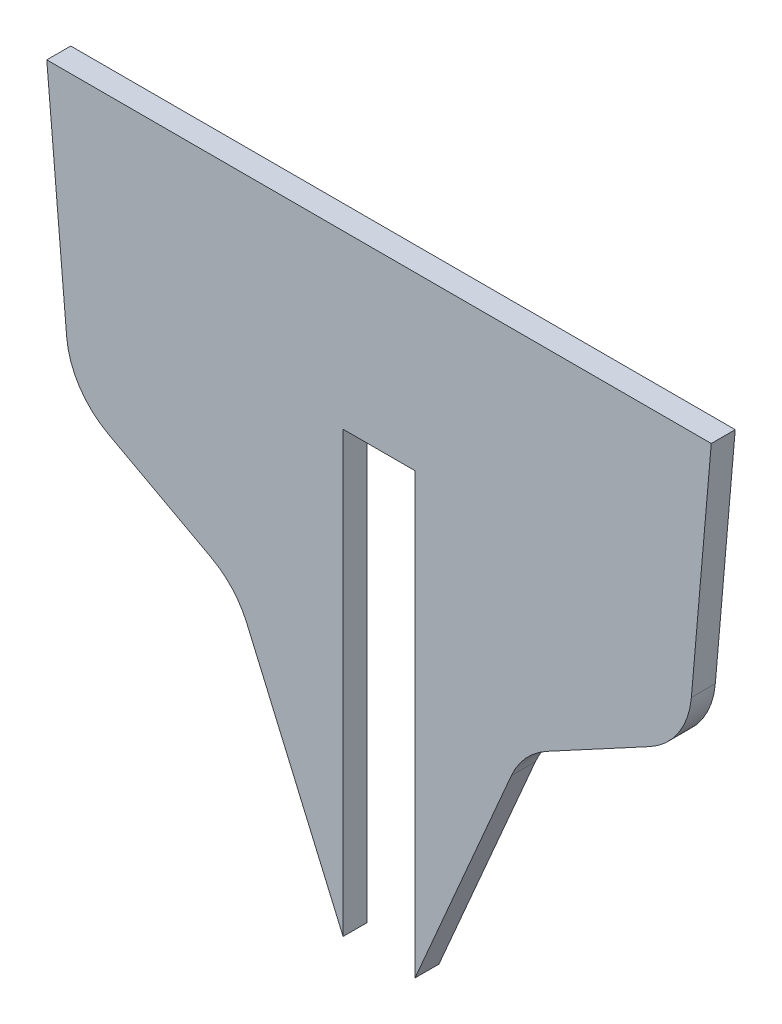
ISO-10303-21;
HEADER;
FILE_DESCRIPTION(('STEP AP214'),'2;1');
FILE_NAME('part.step','',(''),(''),'','','');
FILE_SCHEMA(('AUTOMOTIVE_DESIGN { 1 0 10303 214 1 1 1 1 }'));
ENDSEC;
DATA;
#1=APPLICATION_CONTEXT('core data for automotive mechanical design processes');
#2=APPLICATION_PROTOCOL_DEFINITION('international standard','automotive_design',2000,#1);
#3=PRODUCT_CONTEXT('',#1,'mechanical');
#4=PRODUCT('Part','Part','',(#3));
#5=PRODUCT_RELATED_PRODUCT_CATEGORY('part','',(#4));
#6=PRODUCT_DEFINITION_FORMATION('','',#4);
#7=PRODUCT_DEFINITION_CONTEXT('part definition',#1,'design');
#8=PRODUCT_DEFINITION('design','',#6,#7);
#9=PRODUCT_DEFINITION_SHAPE('','',#8);
#10=(LENGTH_UNIT() NAMED_UNIT(*) SI_UNIT(.MILLI.,.METRE.));
#11=(NAMED_UNIT(*) PLANE_ANGLE_UNIT() SI_UNIT($,.RADIAN.));
#12=(NAMED_UNIT(*) SI_UNIT($,.STERADIAN.) SOLID_ANGLE_UNIT());
#13=UNCERTAINTY_MEASURE_WITH_UNIT(LENGTH_MEASURE(1.E-05),#10,'distance_accuracy_value','');
#14=(GEOMETRIC_REPRESENTATION_CONTEXT(3) GLOBAL_UNCERTAINTY_ASSIGNED_CONTEXT((#13)) GLOBAL_UNIT_ASSIGNED_CONTEXT((#10,
#11,#12)) REPRESENTATION_CONTEXT('',''));
#15=CARTESIAN_POINT('',(0.,0.,0.));
#16=DIRECTION('',(0.,0.,1.));
#17=DIRECTION('',(1.,0.,0.));
#18=AXIS2_PLACEMENT_3D('',#15,#16,#17);
#19=CARTESIAN_POINT('',(2.91719462702832,-65.8529043195632,3.));
#20=DIRECTION('',(-1.,0.,0.));
#21=DIRECTION('',(0.,0.,1.));
#22=AXIS2_PLACEMENT_3D('',#19,#20,#21);
#23=PLANE('',#22);
#24=DIRECTION('',(0.,1.,0.));
#25=VECTOR('',#24,1.);
#26=CARTESIAN_POINT('',(2.91719462702832,-65.8529043195632,0.));
#27=LINE('',#26,#25);
#28=CARTESIAN_POINT('',(2.91719462702832,-65.8529043195632,0.));
#29=VERTEX_POINT('',#28);
#30=CARTESIAN_POINT('',(2.91719462702832,-10.8529043195632,0.));
#31=VERTEX_POINT('',#30);
#32=EDGE_CURVE('E156',#29,#31,#27,.T.);
#33=ORIENTED_EDGE('',*,*,#32,.T.);
#34=DIRECTION('',(0.,0.,-1.));
#35=VECTOR('',#34,1.);
#36=CARTESIAN_POINT('',(2.91719462702832,-10.8529043195632,3.));
#37=LINE('',#36,#35);
#38=CARTESIAN_POINT('',(2.91719462702832,-10.8529043195632,3.));
#39=VERTEX_POINT('',#38);
#40=EDGE_CURVE('E138',#39,#31,#37,.T.);
#41=ORIENTED_EDGE('',*,*,#40,.F.);
#42=DIRECTION('',(0.,1.,0.));
#43=VECTOR('',#42,1.);
#44=CARTESIAN_POINT('',(2.91719462702832,-65.8529043195632,3.));
#45=LINE('',#44,#43);
#46=CARTESIAN_POINT('',(2.91719462702832,-65.8529043195632,3.));
#47=VERTEX_POINT('',#46);
#48=EDGE_CURVE('E144',#47,#39,#45,.T.);
#49=ORIENTED_EDGE('',*,*,#48,.F.);
#50=DIRECTION('',(0.,0.,-1.));
#51=VECTOR('',#50,1.);
#52=CARTESIAN_POINT('',(2.91719462702832,-65.8529043195632,3.));
#53=LINE('',#52,#51);
#54=EDGE_CURVE('E206',#47,#29,#53,.T.);
#55=ORIENTED_EDGE('',*,*,#54,.T.);
#56=EDGE_LOOP('',(#33,#41,#49,#55));
#57=FACE_BOUND('',#56,.T.);
#58=ADVANCED_FACE('F33',(#57),#23,.F.);
#59=CARTESIAN_POINT('',(11.9171946270283,-10.8529043195632,3.));
#60=DIRECTION('',(0.,1.,0.));
#61=DIRECTION('',(0.,0.,1.));
#62=AXIS2_PLACEMENT_3D('',#59,#60,#61);
#63=PLANE('',#62);
#64=DIRECTION('',(1.,0.,0.));
#65=VECTOR('',#64,1.);
#66=CARTESIAN_POINT('',(11.9171946270283,-10.8529043195632,0.));
#67=LINE('',#66,#65);
#68=CARTESIAN_POINT('',(11.9171946270283,-10.8529043195632,0.));
#69=VERTEX_POINT('',#68);
#70=EDGE_CURVE('E216',#31,#69,#67,.T.);
#71=ORIENTED_EDGE('',*,*,#70,.T.);
#72=DIRECTION('',(0.,0.,-1.));
#73=VECTOR('',#72,1.);
#74=CARTESIAN_POINT('',(11.9171946270283,-10.8529043195632,3.));
#75=LINE('',#74,#73);
#76=CARTESIAN_POINT('',(11.9171946270283,-10.8529043195632,3.));
#77=VERTEX_POINT('',#76);
#78=EDGE_CURVE('E141',#77,#69,#75,.T.);
#79=ORIENTED_EDGE('',*,*,#78,.F.);
#80=DIRECTION('',(1.,0.,0.));
#81=VECTOR('',#80,1.);
#82=CARTESIAN_POINT('',(11.9171946270283,-10.8529043195632,3.));
#83=LINE('',#82,#81);
#84=EDGE_CURVE('E134',#39,#77,#83,.T.);
#85=ORIENTED_EDGE('',*,*,#84,.F.);
#86=ORIENTED_EDGE('',*,*,#40,.T.);
#87=EDGE_LOOP('',(#71,#79,#85,#86));
#88=FACE_BOUND('',#87,.T.);
#89=ADVANCED_FACE('F136',(#88),#63,.F.);
#90=CARTESIAN_POINT('',(11.9171946270283,-65.8529043195632,3.));
#91=DIRECTION('',(1.,0.,0.));
#92=DIRECTION('',(0.,0.,-1.));
#93=AXIS2_PLACEMENT_3D('',#90,#91,#92);
#94=PLANE('',#93);
#95=DIRECTION('',(0.,-1.,0.));
#96=VECTOR('',#95,1.);
#97=CARTESIAN_POINT('',(11.9171946270283,-65.8529043195632,0.));
#98=LINE('',#97,#96);
#99=CARTESIAN_POINT('',(11.9171946270283,-65.8529043195632,0.));
#100=VERTEX_POINT('',#99);
#101=EDGE_CURVE('E218',#69,#100,#98,.T.);
#102=ORIENTED_EDGE('',*,*,#101,.T.);
#103=DIRECTION('',(0.,0.,-1.));
#104=VECTOR('',#103,1.);
#105=CARTESIAN_POINT('',(11.9171946270283,-65.8529043195632,3.));
#106=LINE('',#105,#104);
#107=CARTESIAN_POINT('',(11.9171946270283,-65.8529043195632,3.));
#108=VERTEX_POINT('',#107);
#109=EDGE_CURVE('E162',#108,#100,#106,.T.);
#110=ORIENTED_EDGE('',*,*,#109,.F.);
#111=DIRECTION('',(0.,-1.,0.));
#112=VECTOR('',#111,1.);
#113=CARTESIAN_POINT('',(11.9171946270283,-65.8529043195632,3.));
#114=LINE('',#113,#112);
#115=EDGE_CURVE('E143',#77,#108,#114,.T.);
#116=ORIENTED_EDGE('',*,*,#115,.F.);
#117=ORIENTED_EDGE('',*,*,#78,.T.);
#118=EDGE_LOOP('',(#102,#110,#116,#117));
#119=FACE_BOUND('',#118,.T.);
#120=ADVANCED_FACE('F300',(#119),#94,.F.);
#121=CARTESIAN_POINT('',(11.9171946270283,-65.8529043195632,3.));
#122=DIRECTION('',(-0.918213117045522,0.396086697183263,0.));
#123=DIRECTION('',(-0.396086697183263,-0.918213117045522,0.));
#124=AXIS2_PLACEMENT_3D('',#121,#122,#123);
#125=PLANE('',#124);
#126=DIRECTION('',(0.396086697183263,0.918213117045522,0.));
#127=VECTOR('',#126,1.);
#128=CARTESIAN_POINT('',(11.9171946270283,-65.8529043195632,0.));
#129=LINE('',#128,#127);
#130=CARTESIAN_POINT('',(23.9900912183548,-37.8653650012177,0.));
#131=VERTEX_POINT('',#130);
#132=EDGE_CURVE('E220',#100,#131,#129,.T.);
#133=ORIENTED_EDGE('',*,*,#132,.T.);
#134=DIRECTION('',(0.,0.,-1.));
#135=VECTOR('',#134,1.);
#136=CARTESIAN_POINT('',(23.9900912183548,-37.8653650012177,3.));
#137=LINE('',#136,#135);
#138=CARTESIAN_POINT('',(23.9900912183548,-37.8653650012177,3.));
#139=VERTEX_POINT('',#138);
#140=EDGE_CURVE('E178',#131,#139,#137,.F.);
#141=ORIENTED_EDGE('',*,*,#140,.T.);
#142=DIRECTION('',(0.396086697183263,0.918213117045522,0.));
#143=VECTOR('',#142,1.);
#144=CARTESIAN_POINT('',(11.9171946270283,-65.8529043195632,3.));
#145=LINE('',#144,#143);
#146=EDGE_CURVE('E245',#108,#139,#145,.T.);
#147=ORIENTED_EDGE('',*,*,#146,.F.);
#148=ORIENTED_EDGE('',*,*,#109,.T.);
#149=EDGE_LOOP('',(#133,#141,#147,#148));
#150=FACE_BOUND('',#149,.T.);
#151=ADVANCED_FACE('F242',(#150),#125,.F.);
#152=CARTESIAN_POINT('',(25.3659731640509,-34.6757783298439,3.));
#153=DIRECTION('',(-0.474932601123314,0.880022172669668,0.));
#154=DIRECTION('',(-0.880022172669668,-0.474932601123314,0.));
#155=AXIS2_PLACEMENT_3D('',#152,#153,#154);
#156=PLANE('',#155);
#157=DIRECTION('',(0.880022172669668,0.474932601123314,0.));
#158=VECTOR('',#157,1.);
#159=CARTESIAN_POINT('',(25.3659731640509,-34.6757783298439,0.));
#160=LINE('',#159,#158);
#161=CARTESIAN_POINT('',(28.4228963775769,-33.0260102463537,0.));
#162=VERTEX_POINT('',#161);
#163=CARTESIAN_POINT('',(41.3086004808126,-26.0718207303217,0.));
#164=VERTEX_POINT('',#163);
#165=EDGE_CURVE('E223',#162,#164,#160,.T.);
#166=ORIENTED_EDGE('',*,*,#165,.T.);
#167=DIRECTION('',(0.,0.,-1.));
#168=VECTOR('',#167,1.);
#169=CARTESIAN_POINT('',(41.3086004808126,-26.0718207303217,3.));
#170=LINE('',#169,#168);
#171=CARTESIAN_POINT('',(41.3086004808126,-26.0718207303217,3.));
#172=VERTEX_POINT('',#171);
#173=EDGE_CURVE('E172',#164,#172,#170,.F.);
#174=ORIENTED_EDGE('',*,*,#173,.T.);
#175=DIRECTION('',(0.880022172669668,0.474932601123314,0.));
#176=VECTOR('',#175,1.);
#177=CARTESIAN_POINT('',(25.3659731640509,-34.6757783298439,3.));
#178=LINE('',#177,#176);
#179=CARTESIAN_POINT('',(28.4228963775769,-33.0260102463537,3.));
#180=VERTEX_POINT('',#179);
#181=EDGE_CURVE('E257',#180,#172,#178,.T.);
#182=ORIENTED_EDGE('',*,*,#181,.F.);
#183=DIRECTION('',(0.,0.,-1.));
#184=VECTOR('',#183,1.);
#185=CARTESIAN_POINT('',(28.4228963775769,-33.0260102463537,0.));
#186=LINE('',#185,#184);
#187=EDGE_CURVE('E169',#180,#162,#186,.T.);
#188=ORIENTED_EDGE('',*,*,#187,.T.);
#189=EDGE_LOOP('',(#166,#174,#182,#188));
#190=FACE_BOUND('',#189,.T.);
#191=ADVANCED_FACE('F255',(#190),#156,.F.);
#192=CARTESIAN_POINT('',(46.0568504296138,-23.5092731389052,3.));
#193=DIRECTION('',(-0.996276448328469,0.0862162311053482,0.));
#194=DIRECTION('',(-0.0862162311053482,-0.996276448328469,0.));
#195=AXIS2_PLACEMENT_3D('',#192,#193,#194);
#196=PLANE('',#195);
#197=DIRECTION('',(0.0862162311053482,0.996276448328469,0.));
#198=VECTOR('',#197,1.);
#199=CARTESIAN_POINT('',(46.0568504296138,-23.5092731389052,3.));
#200=LINE('',#199,#198);
#201=CARTESIAN_POINT('',(46.5220389528642,-18.1337613146785,3.));
#202=VERTEX_POINT('',#201);
#203=CARTESIAN_POINT('',(49.0126900389799,10.6470956804368,3.));
#204=VERTEX_POINT('',#203);
#205=EDGE_CURVE('E259',#202,#204,#200,.T.);
#206=ORIENTED_EDGE('',*,*,#205,.F.);
#207=DIRECTION('',(0.,0.,-1.));
#208=VECTOR('',#207,1.);
#209=CARTESIAN_POINT('',(46.5220389528642,-18.1337613146785,3.));
#210=LINE('',#209,#208);
#211=CARTESIAN_POINT('',(46.5220389528642,-18.1337613146785,0.));
#212=VERTEX_POINT('',#211);
#213=EDGE_CURVE('E157',#202,#212,#210,.T.);
#214=ORIENTED_EDGE('',*,*,#213,.T.);
#215=DIRECTION('',(0.0862162311053482,0.996276448328469,0.));
#216=VECTOR('',#215,1.);
#217=CARTESIAN_POINT('',(46.0568504296138,-23.5092731389052,0.));
#218=LINE('',#217,#216);
#219=CARTESIAN_POINT('',(49.0126900389799,10.6470956804368,0.));
#220=VERTEX_POINT('',#219);
#221=EDGE_CURVE('E226',#212,#220,#218,.T.);
#222=ORIENTED_EDGE('',*,*,#221,.T.);
#223=DIRECTION('',(0.,0.,-1.));
#224=VECTOR('',#223,1.);
#225=CARTESIAN_POINT('',(49.0126900389799,10.6470956804368,3.));
#226=LINE('',#225,#224);
#227=EDGE_CURVE('E235',#204,#220,#226,.T.);
#228=ORIENTED_EDGE('',*,*,#227,.F.);
#229=EDGE_LOOP('',(#206,#214,#222,#228));
#230=FACE_BOUND('',#229,.T.);
#231=ADVANCED_FACE('F283',(#230),#196,.F.);
#232=CARTESIAN_POINT('',(-34.1783007849233,10.6470956804368,3.));
#233=DIRECTION('',(0.,-1.,0.));
#234=DIRECTION('',(0.,0.,-1.));
#235=AXIS2_PLACEMENT_3D('',#232,#233,#234);
#236=PLANE('',#235);
#237=DIRECTION('',(-1.,0.,0.));
#238=VECTOR('',#237,1.);
#239=CARTESIAN_POINT('',(-34.1783007849233,10.6470956804368,0.));
#240=LINE('',#239,#238);
#241=CARTESIAN_POINT('',(-34.1783007849233,10.6470956804368,0.));
#242=VERTEX_POINT('',#241);
#243=EDGE_CURVE('E228',#220,#242,#240,.T.);
#244=ORIENTED_EDGE('',*,*,#243,.T.);
#245=DIRECTION('',(0.,0.,-1.));
#246=VECTOR('',#245,1.);
#247=CARTESIAN_POINT('',(-34.1783007849233,10.6470956804368,3.));
#248=LINE('',#247,#246);
#249=CARTESIAN_POINT('',(-34.1783007849233,10.6470956804368,3.));
#250=VERTEX_POINT('',#249);
#251=EDGE_CURVE('E209',#250,#242,#248,.T.);
#252=ORIENTED_EDGE('',*,*,#251,.F.);
#253=DIRECTION('',(-1.,0.,0.));
#254=VECTOR('',#253,1.);
#255=CARTESIAN_POINT('',(-34.1783007849233,10.6470956804368,3.));
#256=LINE('',#255,#254);
#257=EDGE_CURVE('E261',#204,#250,#256,.T.);
#258=ORIENTED_EDGE('',*,*,#257,.F.);
#259=ORIENTED_EDGE('',*,*,#227,.T.);
#260=EDGE_LOOP('',(#244,#252,#258,#259));
#261=FACE_BOUND('',#260,.T.);
#262=ADVANCED_FACE('F279',(#261),#236,.F.);
#263=CARTESIAN_POINT('',(-31.2224611755571,-23.5092731389052,3.));
#264=DIRECTION('',(0.996276448328469,0.0862162311053482,0.));
#265=DIRECTION('',(-0.0862162311053482,0.996276448328469,0.));
#266=AXIS2_PLACEMENT_3D('',#263,#264,#265);
#267=PLANE('',#266);
#268=DIRECTION('',(0.0862162311053482,-0.996276448328469,0.));
#269=VECTOR('',#268,1.);
#270=CARTESIAN_POINT('',(-31.2224611755571,-23.5092731389052,0.));
#271=LINE('',#270,#269);
#272=CARTESIAN_POINT('',(-31.6876496988075,-18.1337613146785,0.));
#273=VERTEX_POINT('',#272);
#274=EDGE_CURVE('E202',#242,#273,#271,.T.);
#275=ORIENTED_EDGE('',*,*,#274,.T.);
#276=DIRECTION('',(0.,0.,-1.));
#277=VECTOR('',#276,1.);
#278=CARTESIAN_POINT('',(-31.6876496988075,-18.1337613146785,3.));
#279=LINE('',#278,#277);
#280=CARTESIAN_POINT('',(-31.6876496988075,-18.1337613146785,3.));
#281=VERTEX_POINT('',#280);
#282=EDGE_CURVE('E184',#273,#281,#279,.F.);
#283=ORIENTED_EDGE('',*,*,#282,.T.);
#284=DIRECTION('',(0.0862162311053482,-0.996276448328469,0.));
#285=VECTOR('',#284,1.);
#286=CARTESIAN_POINT('',(-31.2224611755571,-23.5092731389052,3.));
#287=LINE('',#286,#285);
#288=EDGE_CURVE('E211',#250,#281,#287,.T.);
#289=ORIENTED_EDGE('',*,*,#288,.F.);
#290=ORIENTED_EDGE('',*,*,#251,.T.);
#291=EDGE_LOOP('',(#275,#283,#289,#290));
#292=FACE_BOUND('',#291,.T.);
#293=ADVANCED_FACE('F277',(#292),#267,.F.);
#294=CARTESIAN_POINT('',(-10.5315839099942,-34.6757783298439,3.));
#295=DIRECTION('',(0.474932601123314,0.880022172669668,0.));
#296=DIRECTION('',(-0.880022172669668,0.474932601123314,0.));
#297=AXIS2_PLACEMENT_3D('',#294,#295,#296);
#298=PLANE('',#297);
#299=DIRECTION('',(0.880022172669668,-0.474932601123314,0.));
#300=VECTOR('',#299,1.);
#301=CARTESIAN_POINT('',(-10.5315839099942,-34.6757783298439,3.));
#302=LINE('',#301,#300);
#303=CARTESIAN_POINT('',(-26.474211226756,-26.0718207303217,3.));
#304=VERTEX_POINT('',#303);
#305=CARTESIAN_POINT('',(-13.5885071235203,-33.0260102463537,3.));
#306=VERTEX_POINT('',#305);
#307=EDGE_CURVE('E207',#304,#306,#302,.T.);
#308=ORIENTED_EDGE('',*,*,#307,.F.);
#309=DIRECTION('',(0.,0.,-1.));
#310=VECTOR('',#309,1.);
#311=CARTESIAN_POINT('',(-26.474211226756,-26.0718207303217,3.));
#312=LINE('',#311,#310);
#313=CARTESIAN_POINT('',(-26.474211226756,-26.0718207303217,0.));
#314=VERTEX_POINT('',#313);
#315=EDGE_CURVE('E181',#304,#314,#312,.T.);
#316=ORIENTED_EDGE('',*,*,#315,.T.);
#317=DIRECTION('',(0.880022172669668,-0.474932601123314,0.));
#318=VECTOR('',#317,1.);
#319=CARTESIAN_POINT('',(-10.5315839099942,-34.6757783298439,0.));
#320=LINE('',#319,#318);
#321=CARTESIAN_POINT('',(-13.5885071235203,-33.0260102463537,0.));
#322=VERTEX_POINT('',#321);
#323=EDGE_CURVE('E197',#314,#322,#320,.T.);
#324=ORIENTED_EDGE('',*,*,#323,.T.);
#325=DIRECTION('',(0.,0.,-1.));
#326=VECTOR('',#325,1.);
#327=CARTESIAN_POINT('',(-13.5885071235203,-33.0260102463537,3.));
#328=LINE('',#327,#326);
#329=EDGE_CURVE('E54',#322,#306,#328,.F.);
#330=ORIENTED_EDGE('',*,*,#329,.T.);
#331=EDGE_LOOP('',(#308,#316,#324,#330));
#332=FACE_BOUND('',#331,.T.);
#333=ADVANCED_FACE('F200',(#332),#298,.F.);
#334=CARTESIAN_POINT('',(2.91719462702832,-65.8529043195632,3.));
#335=DIRECTION('',(0.918213117045522,0.396086697183263,0.));
#336=DIRECTION('',(-0.396086697183263,0.918213117045522,0.));
#337=AXIS2_PLACEMENT_3D('',#334,#335,#336);
#338=PLANE('',#337);
#339=DIRECTION('',(0.396086697183263,-0.918213117045522,0.));
#340=VECTOR('',#339,1.);
#341=CARTESIAN_POINT('',(2.91719462702832,-65.8529043195632,3.));
#342=LINE('',#341,#340);
#343=CARTESIAN_POINT('',(-9.15570196429822,-37.8653650012177,3.));
#344=VERTEX_POINT('',#343);
#345=EDGE_CURVE('E149',#344,#47,#342,.T.);
#346=ORIENTED_EDGE('',*,*,#345,.F.);
#347=DIRECTION('',(0.,0.,-1.));
#348=VECTOR('',#347,1.);
#349=CARTESIAN_POINT('',(-9.15570196429822,-37.8653650012177,0.));
#350=LINE('',#349,#348);
#351=CARTESIAN_POINT('',(-9.15570196429822,-37.8653650012177,0.));
#352=VERTEX_POINT('',#351);
#353=EDGE_CURVE('E186',#344,#352,#350,.T.);
#354=ORIENTED_EDGE('',*,*,#353,.T.);
#355=DIRECTION('',(0.396086697183263,-0.918213117045522,0.));
#356=VECTOR('',#355,1.);
#357=CARTESIAN_POINT('',(2.91719462702832,-65.8529043195632,0.));
#358=LINE('',#357,#356);
#359=EDGE_CURVE('E153',#352,#29,#358,.T.);
#360=ORIENTED_EDGE('',*,*,#359,.T.);
#361=ORIENTED_EDGE('',*,*,#54,.F.);
#362=EDGE_LOOP('',(#346,#354,#360,#361));
#363=FACE_BOUND('',#362,.T.);
#364=ADVANCED_FACE('F205',(#363),#338,.F.);
#365=CARTESIAN_POINT('',(0.,0.,3.));
#366=DIRECTION('',(0.,0.,1.));
#367=DIRECTION('',(1.,0.,0.));
#368=AXIS2_PLACEMENT_3D('',#365,#366,#367);
#369=PLANE('',#368);
#370=ORIENTED_EDGE('',*,*,#181,.T.);
#371=CARTESIAN_POINT('',(36.5592744695795,-17.271599003625,3.));
#372=DIRECTION('',(0.,0.,1.));
#373=DIRECTION('',(1.,0.,0.));
#374=AXIS2_PLACEMENT_3D('',#371,#372,#373);
#375=CIRCLE('',#374,10.);
#376=EDGE_CURVE('E176',#172,#202,#375,.T.);
#377=ORIENTED_EDGE('',*,*,#376,.T.);
#378=ORIENTED_EDGE('',*,*,#205,.T.);
#379=ORIENTED_EDGE('',*,*,#257,.T.);
#380=ORIENTED_EDGE('',*,*,#288,.T.);
#381=CARTESIAN_POINT('',(-21.7248852155228,-17.271599003625,3.));
#382=DIRECTION('',(0.,0.,1.));
#383=DIRECTION('',(1.,0.,0.));
#384=AXIS2_PLACEMENT_3D('',#381,#382,#383);
#385=CIRCLE('',#384,10.);
#386=EDGE_CURVE('E174',#281,#304,#385,.T.);
#387=ORIENTED_EDGE('',*,*,#386,.T.);
#388=ORIENTED_EDGE('',*,*,#307,.T.);
#389=CARTESIAN_POINT('',(-18.3378331347534,-41.8262319730503,3.));
#390=DIRECTION('',(0.,0.,1.));
#391=DIRECTION('',(1.,0.,0.));
#392=AXIS2_PLACEMENT_3D('',#389,#390,#391);
#393=CIRCLE('',#392,10.);
#394=EDGE_CURVE('E11',#306,#344,#393,.F.);
#395=ORIENTED_EDGE('',*,*,#394,.T.);
#396=ORIENTED_EDGE('',*,*,#345,.T.);
#397=ORIENTED_EDGE('',*,*,#48,.T.);
#398=ORIENTED_EDGE('',*,*,#84,.T.);
#399=ORIENTED_EDGE('',*,*,#115,.T.);
#400=ORIENTED_EDGE('',*,*,#146,.T.);
#401=CARTESIAN_POINT('',(33.1722223888101,-41.8262319730503,3.));
#402=DIRECTION('',(0.,0.,1.));
#403=DIRECTION('',(1.,0.,0.));
#404=AXIS2_PLACEMENT_3D('',#401,#402,#403);
#405=CIRCLE('',#404,10.);
#406=EDGE_CURVE('E191',#139,#180,#405,.F.);
#407=ORIENTED_EDGE('',*,*,#406,.T.);
#408=EDGE_LOOP('',(#370,#377,#378,#379,#380,#387,#388,#395,#396,#397,#398,#399,#400,#407));
#409=FACE_BOUND('',#408,.T.);
#410=ADVANCED_FACE('F148',(#409),#369,.T.);
#411=CARTESIAN_POINT('',(0.,0.,0.));
#412=DIRECTION('',(0.,0.,1.));
#413=DIRECTION('',(1.,0.,0.));
#414=AXIS2_PLACEMENT_3D('',#411,#412,#413);
#415=PLANE('',#414);
#416=ORIENTED_EDGE('',*,*,#221,.F.);
#417=CARTESIAN_POINT('',(36.5592744695795,-17.271599003625,0.));
#418=DIRECTION('',(0.,0.,1.));
#419=DIRECTION('',(1.,0.,0.));
#420=AXIS2_PLACEMENT_3D('',#417,#418,#419);
#421=CIRCLE('',#420,10.);
#422=EDGE_CURVE('E167',#212,#164,#421,.F.);
#423=ORIENTED_EDGE('',*,*,#422,.T.);
#424=ORIENTED_EDGE('',*,*,#165,.F.);
#425=CARTESIAN_POINT('',(33.1722223888101,-41.8262319730503,0.));
#426=DIRECTION('',(0.,0.,1.));
#427=DIRECTION('',(1.,0.,0.));
#428=AXIS2_PLACEMENT_3D('',#425,#426,#427);
#429=CIRCLE('',#428,10.);
#430=EDGE_CURVE('E189',#162,#131,#429,.T.);
#431=ORIENTED_EDGE('',*,*,#430,.T.);
#432=ORIENTED_EDGE('',*,*,#132,.F.);
#433=ORIENTED_EDGE('',*,*,#101,.F.);
#434=ORIENTED_EDGE('',*,*,#70,.F.);
#435=ORIENTED_EDGE('',*,*,#32,.F.);
#436=ORIENTED_EDGE('',*,*,#359,.F.);
#437=CARTESIAN_POINT('',(-18.3378331347534,-41.8262319730503,0.));
#438=DIRECTION('',(0.,0.,1.));
#439=DIRECTION('',(1.,0.,0.));
#440=AXIS2_PLACEMENT_3D('',#437,#438,#439);
#441=CIRCLE('',#440,10.);
#442=EDGE_CURVE('E41',#352,#322,#441,.T.);
#443=ORIENTED_EDGE('',*,*,#442,.T.);
#444=ORIENTED_EDGE('',*,*,#323,.F.);
#445=CARTESIAN_POINT('',(-21.7248852155228,-17.271599003625,0.));
#446=DIRECTION('',(0.,0.,1.));
#447=DIRECTION('',(1.,0.,0.));
#448=AXIS2_PLACEMENT_3D('',#445,#446,#447);
#449=CIRCLE('',#448,10.);
#450=EDGE_CURVE('E160',#314,#273,#449,.F.);
#451=ORIENTED_EDGE('',*,*,#450,.T.);
#452=ORIENTED_EDGE('',*,*,#274,.F.);
#453=ORIENTED_EDGE('',*,*,#243,.F.);
#454=EDGE_LOOP('',(#416,#423,#424,#431,#432,#433,#434,#435,#436,#443,#444,#451,#452,#453));
#455=FACE_BOUND('',#454,.T.);
#456=ADVANCED_FACE('F196',(#455),#415,.F.);
#457=CARTESIAN_POINT('',(36.5592744695795,-17.271599003625,3.));
#458=DIRECTION('',(0.,0.,-1.));
#459=DIRECTION('',(-1.,0.,0.));
#460=AXIS2_PLACEMENT_3D('',#457,#458,#459);
#461=CYLINDRICAL_SURFACE('',#460,10.);
#462=ORIENTED_EDGE('',*,*,#376,.F.);
#463=ORIENTED_EDGE('',*,*,#173,.F.);
#464=ORIENTED_EDGE('',*,*,#422,.F.);
#465=ORIENTED_EDGE('',*,*,#213,.F.);
#466=EDGE_LOOP('',(#462,#463,#464,#465));
#467=FACE_BOUND('',#466,.T.);
#468=ADVANCED_FACE('F286',(#467),#461,.T.);
#469=CARTESIAN_POINT('',(33.1722223888101,-41.8262319730503,3.));
#470=DIRECTION('',(0.,0.,1.));
#471=DIRECTION('',(1.,0.,0.));
#472=AXIS2_PLACEMENT_3D('',#469,#470,#471);
#473=CYLINDRICAL_SURFACE('',#472,10.);
#474=ORIENTED_EDGE('',*,*,#406,.F.);
#475=ORIENTED_EDGE('',*,*,#140,.F.);
#476=ORIENTED_EDGE('',*,*,#430,.F.);
#477=ORIENTED_EDGE('',*,*,#187,.F.);
#478=EDGE_LOOP('',(#474,#475,#476,#477));
#479=FACE_BOUND('',#478,.T.);
#480=ADVANCED_FACE('F252',(#479),#473,.F.);
#481=CARTESIAN_POINT('',(-21.7248852155228,-17.271599003625,3.));
#482=DIRECTION('',(0.,0.,-1.));
#483=DIRECTION('',(-1.,0.,0.));
#484=AXIS2_PLACEMENT_3D('',#481,#482,#483);
#485=CYLINDRICAL_SURFACE('',#484,10.);
#486=ORIENTED_EDGE('',*,*,#386,.F.);
#487=ORIENTED_EDGE('',*,*,#282,.F.);
#488=ORIENTED_EDGE('',*,*,#450,.F.);
#489=ORIENTED_EDGE('',*,*,#315,.F.);
#490=EDGE_LOOP('',(#486,#487,#488,#489));
#491=FACE_BOUND('',#490,.T.);
#492=ADVANCED_FACE('F274',(#491),#485,.T.);
#493=CARTESIAN_POINT('',(-18.3378331347534,-41.8262319730503,3.));
#494=DIRECTION('',(0.,0.,1.));
#495=DIRECTION('',(1.,0.,0.));
#496=AXIS2_PLACEMENT_3D('',#493,#494,#495);
#497=CYLINDRICAL_SURFACE('',#496,10.);
#498=ORIENTED_EDGE('',*,*,#394,.F.);
#499=ORIENTED_EDGE('',*,*,#329,.F.);
#500=ORIENTED_EDGE('',*,*,#442,.F.);
#501=ORIENTED_EDGE('',*,*,#353,.F.);
#502=EDGE_LOOP('',(#498,#499,#500,#501));
#503=FACE_BOUND('',#502,.T.);
#504=ADVANCED_FACE('F35',(#503),#497,.F.);
#505=CLOSED_SHELL('',(#58,#89,#120,#151,#191,#231,#262,#293,#333,#364,#410,#456,#468,#480,#492,#504));
#506=MANIFOLD_SOLID_BREP('B2',#505);
#507=ADVANCED_BREP_SHAPE_REPRESENTATION('',(#18,#506),#14);
#508=SHAPE_DEFINITION_REPRESENTATION(#9,#507);
ENDSEC;
END-ISO-10303-21;
